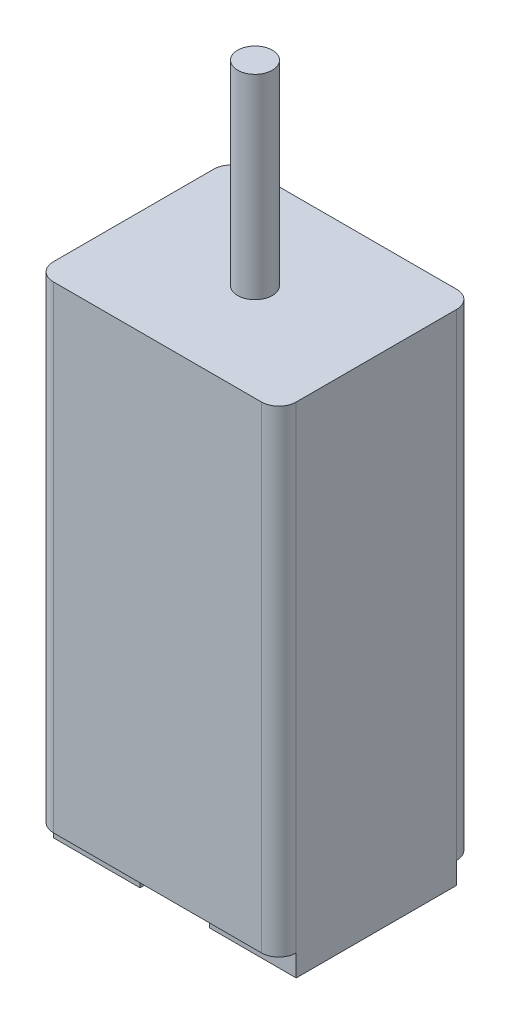
ISO-10303-21;
HEADER;
FILE_DESCRIPTION(('STEP AP214'),'2;1');
FILE_NAME('part.step','',(''),(''),'','','');
FILE_SCHEMA(('AUTOMOTIVE_DESIGN { 1 0 10303 214 1 1 1 1 }'));
ENDSEC;
DATA;
#1=APPLICATION_CONTEXT('core data for automotive mechanical design processes');
#2=APPLICATION_PROTOCOL_DEFINITION('international standard','automotive_design',2000,#1);
#3=PRODUCT_CONTEXT('',#1,'mechanical');
#4=PRODUCT('Part','Part','',(#3));
#5=PRODUCT_RELATED_PRODUCT_CATEGORY('part','',(#4));
#6=PRODUCT_DEFINITION_FORMATION('','',#4);
#7=PRODUCT_DEFINITION_CONTEXT('part definition',#1,'design');
#8=PRODUCT_DEFINITION('design','',#6,#7);
#9=PRODUCT_DEFINITION_SHAPE('','',#8);
#10=(LENGTH_UNIT() NAMED_UNIT(*) SI_UNIT(.MILLI.,.METRE.));
#11=(NAMED_UNIT(*) PLANE_ANGLE_UNIT() SI_UNIT($,.RADIAN.));
#12=(NAMED_UNIT(*) SI_UNIT($,.STERADIAN.) SOLID_ANGLE_UNIT());
#13=UNCERTAINTY_MEASURE_WITH_UNIT(LENGTH_MEASURE(1.E-05),#10,'distance_accuracy_value','');
#14=(GEOMETRIC_REPRESENTATION_CONTEXT(3) GLOBAL_UNCERTAINTY_ASSIGNED_CONTEXT((#13)) GLOBAL_UNIT_ASSIGNED_CONTEXT((#10,
#11,#12)) REPRESENTATION_CONTEXT('',''));
#15=CARTESIAN_POINT('',(0.,0.,0.));
#16=DIRECTION('',(0.,0.,1.));
#17=DIRECTION('',(1.,0.,0.));
#18=AXIS2_PLACEMENT_3D('',#15,#16,#17);
#19=CARTESIAN_POINT('',(0.,0.,0.));
#20=DIRECTION('',(0.,1.,0.));
#21=DIRECTION('',(0.,0.,1.));
#22=AXIS2_PLACEMENT_3D('',#19,#20,#21);
#23=PLANE('',#22);
#24=DIRECTION('',(-1.,0.,0.));
#25=VECTOR('',#24,1.);
#26=CARTESIAN_POINT('',(2.8,0.,1.85));
#27=LINE('',#26,#25);
#28=CARTESIAN_POINT('',(2.8,0.,1.85));
#29=VERTEX_POINT('',#28);
#30=CARTESIAN_POINT('',(0.8,0.,1.85));
#31=VERTEX_POINT('',#30);
#32=EDGE_CURVE('E321',#29,#31,#27,.T.);
#33=ORIENTED_EDGE('',*,*,#32,.F.);
#34=CARTESIAN_POINT('',(2.4,0.,1.85));
#35=DIRECTION('',(0.,1.,0.));
#36=DIRECTION('',(0.,0.,1.));
#37=AXIS2_PLACEMENT_3D('',#34,#35,#36);
#38=CIRCLE('',#37,0.4);
#39=CARTESIAN_POINT('',(2.4,0.,2.25));
#40=VERTEX_POINT('',#39);
#41=EDGE_CURVE('E271',#29,#40,#38,.F.);
#42=ORIENTED_EDGE('',*,*,#41,.T.);
#43=DIRECTION('',(1.,0.,0.));
#44=VECTOR('',#43,1.);
#45=CARTESIAN_POINT('',(-2.8,0.,2.25));
#46=LINE('',#45,#44);
#47=CARTESIAN_POINT('',(-2.4,0.,2.25));
#48=VERTEX_POINT('',#47);
#49=EDGE_CURVE('E246',#48,#40,#46,.T.);
#50=ORIENTED_EDGE('',*,*,#49,.F.);
#51=CARTESIAN_POINT('',(-2.4,0.,1.85));
#52=DIRECTION('',(0.,1.,0.));
#53=DIRECTION('',(0.,0.,1.));
#54=AXIS2_PLACEMENT_3D('',#51,#52,#53);
#55=CIRCLE('',#54,0.4);
#56=CARTESIAN_POINT('',(-2.8,0.,1.85));
#57=VERTEX_POINT('',#56);
#58=EDGE_CURVE('E274',#48,#57,#55,.F.);
#59=ORIENTED_EDGE('',*,*,#58,.T.);
#60=DIRECTION('',(-1.,0.,0.));
#61=VECTOR('',#60,1.);
#62=CARTESIAN_POINT('',(-2.8,0.,1.85));
#63=LINE('',#62,#61);
#64=CARTESIAN_POINT('',(-0.8,0.,1.85));
#65=VERTEX_POINT('',#64);
#66=EDGE_CURVE('E55',#65,#57,#63,.T.);
#67=ORIENTED_EDGE('',*,*,#66,.F.);
#68=DIRECTION('',(0.,0.,1.));
#69=VECTOR('',#68,1.);
#70=CARTESIAN_POINT('',(-0.8,0.,1.85));
#71=LINE('',#70,#69);
#72=CARTESIAN_POINT('',(-0.8,0.,-0.691387744426284));
#73=VERTEX_POINT('',#72);
#74=EDGE_CURVE('E59',#73,#65,#71,.T.);
#75=ORIENTED_EDGE('',*,*,#74,.F.);
#76=CARTESIAN_POINT('',(-0.93929380291808,0.,-1.27069387221314));
#77=DIRECTION('',(0.,-1.,0.));
#78=DIRECTION('',(0.,0.,-1.));
#79=AXIS2_PLACEMENT_3D('',#76,#77,#78);
#80=CIRCLE('',#79,0.595817382444306);
#81=CARTESIAN_POINT('',(-0.799999999999999,0.,-1.85));
#82=VERTEX_POINT('',#81);
#83=EDGE_CURVE('E184',#82,#73,#80,.T.);
#84=ORIENTED_EDGE('',*,*,#83,.F.);
#85=DIRECTION('',(1.,0.,0.));
#86=VECTOR('',#85,1.);
#87=CARTESIAN_POINT('',(-2.8,0.,-1.85));
#88=LINE('',#87,#86);
#89=CARTESIAN_POINT('',(-2.8,0.,-1.85));
#90=VERTEX_POINT('',#89);
#91=EDGE_CURVE('E179',#90,#82,#88,.T.);
#92=ORIENTED_EDGE('',*,*,#91,.F.);
#93=CARTESIAN_POINT('',(-2.4,0.,-1.85));
#94=DIRECTION('',(0.,1.,0.));
#95=DIRECTION('',(0.,0.,1.));
#96=AXIS2_PLACEMENT_3D('',#93,#94,#95);
#97=CIRCLE('',#96,0.4);
#98=CARTESIAN_POINT('',(-2.4,0.,-2.25));
#99=VERTEX_POINT('',#98);
#100=EDGE_CURVE('E277',#90,#99,#97,.F.);
#101=ORIENTED_EDGE('',*,*,#100,.T.);
#102=DIRECTION('',(-1.,0.,0.));
#103=VECTOR('',#102,1.);
#104=CARTESIAN_POINT('',(-2.8,0.,-2.25));
#105=LINE('',#104,#103);
#106=CARTESIAN_POINT('',(2.4,0.,-2.25));
#107=VERTEX_POINT('',#106);
#108=EDGE_CURVE('E237',#107,#99,#105,.T.);
#109=ORIENTED_EDGE('',*,*,#108,.F.);
#110=CARTESIAN_POINT('',(2.4,0.,-1.85));
#111=DIRECTION('',(0.,1.,0.));
#112=DIRECTION('',(0.,0.,1.));
#113=AXIS2_PLACEMENT_3D('',#110,#111,#112);
#114=CIRCLE('',#113,0.4);
#115=CARTESIAN_POINT('',(2.8,0.,-1.85));
#116=VERTEX_POINT('',#115);
#117=EDGE_CURVE('E280',#107,#116,#114,.F.);
#118=ORIENTED_EDGE('',*,*,#117,.T.);
#119=DIRECTION('',(1.,0.,0.));
#120=VECTOR('',#119,1.);
#121=CARTESIAN_POINT('',(2.8,0.,-1.85));
#122=LINE('',#121,#120);
#123=CARTESIAN_POINT('',(0.799999999999999,0.,-1.85));
#124=VERTEX_POINT('',#123);
#125=EDGE_CURVE('E171',#124,#116,#122,.T.);
#126=ORIENTED_EDGE('',*,*,#125,.F.);
#127=CARTESIAN_POINT('',(0.996674762888389,0.,-1.27069387221314));
#128=DIRECTION('',(0.,-1.,0.));
#129=DIRECTION('',(0.,0.,-1.));
#130=AXIS2_PLACEMENT_3D('',#127,#128,#129);
#131=CIRCLE('',#130,0.611781457751547);
#132=CARTESIAN_POINT('',(0.8,0.,-0.691387744426284));
#133=VERTEX_POINT('',#132);
#134=EDGE_CURVE('E327',#133,#124,#131,.T.);
#135=ORIENTED_EDGE('',*,*,#134,.F.);
#136=DIRECTION('',(0.,0.,-1.));
#137=VECTOR('',#136,1.);
#138=CARTESIAN_POINT('',(0.8,0.,1.85));
#139=LINE('',#138,#137);
#140=EDGE_CURVE('E323',#31,#133,#139,.T.);
#141=ORIENTED_EDGE('',*,*,#140,.F.);
#142=EDGE_LOOP('',(#33,#42,#50,#59,#67,#75,#84,#92,#101,#109,#118,#126,#135,#141));
#143=FACE_BOUND('',#142,.T.);
#144=ADVANCED_FACE('F39',(#143),#23,.F.);
#145=CARTESIAN_POINT('',(2.8,11.,-2.25));
#146=DIRECTION('',(-1.,0.,0.));
#147=DIRECTION('',(0.,0.,1.));
#148=AXIS2_PLACEMENT_3D('',#145,#146,#147);
#149=PLANE('',#148);
#150=DIRECTION('',(0.,-1.,0.));
#151=VECTOR('',#150,1.);
#152=CARTESIAN_POINT('',(2.8,11.,1.85));
#153=LINE('',#152,#151);
#154=CARTESIAN_POINT('',(2.8,11.,1.85));
#155=VERTEX_POINT('',#154);
#156=EDGE_CURVE('E177',#155,#29,#153,.T.);
#157=ORIENTED_EDGE('',*,*,#156,.T.);
#158=DIRECTION('',(0.,1.,0.));
#159=VECTOR('',#158,1.);
#160=CARTESIAN_POINT('',(2.8,-0.5,1.85));
#161=LINE('',#160,#159);
#162=CARTESIAN_POINT('',(2.8,-0.5,1.85));
#163=VERTEX_POINT('',#162);
#164=EDGE_CURVE('E154',#163,#29,#161,.T.);
#165=ORIENTED_EDGE('',*,*,#164,.F.);
#166=DIRECTION('',(0.,0.,1.));
#167=VECTOR('',#166,1.);
#168=CARTESIAN_POINT('',(2.8,-0.5,1.85));
#169=LINE('',#168,#167);
#170=CARTESIAN_POINT('',(2.8,-0.5,-1.85));
#171=VERTEX_POINT('',#170);
#172=EDGE_CURVE('E162',#171,#163,#169,.T.);
#173=ORIENTED_EDGE('',*,*,#172,.F.);
#174=DIRECTION('',(0.,1.,0.));
#175=VECTOR('',#174,1.);
#176=CARTESIAN_POINT('',(2.8,-0.5,-1.85));
#177=LINE('',#176,#175);
#178=EDGE_CURVE('E337',#171,#116,#177,.T.);
#179=ORIENTED_EDGE('',*,*,#178,.T.);
#180=DIRECTION('',(0.,-1.,0.));
#181=VECTOR('',#180,1.);
#182=CARTESIAN_POINT('',(2.8,11.,-1.85));
#183=LINE('',#182,#181);
#184=CARTESIAN_POINT('',(2.8,11.,-1.85));
#185=VERTEX_POINT('',#184);
#186=EDGE_CURVE('E286',#116,#185,#183,.F.);
#187=ORIENTED_EDGE('',*,*,#186,.T.);
#188=DIRECTION('',(0.,0.,-1.));
#189=VECTOR('',#188,1.);
#190=CARTESIAN_POINT('',(2.8,11.,-2.25));
#191=LINE('',#190,#189);
#192=EDGE_CURVE('E241',#155,#185,#191,.T.);
#193=ORIENTED_EDGE('',*,*,#192,.F.);
#194=EDGE_LOOP('',(#157,#165,#173,#179,#187,#193));
#195=FACE_BOUND('',#194,.T.);
#196=ADVANCED_FACE('F174',(#195),#149,.F.);
#197=CARTESIAN_POINT('',(-2.8,11.,-2.25));
#198=DIRECTION('',(0.,0.,1.));
#199=DIRECTION('',(1.,0.,0.));
#200=AXIS2_PLACEMENT_3D('',#197,#198,#199);
#201=PLANE('',#200);
#202=DIRECTION('',(-1.,0.,0.));
#203=VECTOR('',#202,1.);
#204=CARTESIAN_POINT('',(-2.8,11.,-2.25));
#205=LINE('',#204,#203);
#206=CARTESIAN_POINT('',(2.4,11.,-2.25));
#207=VERTEX_POINT('',#206);
#208=CARTESIAN_POINT('',(-2.4,11.,-2.25));
#209=VERTEX_POINT('',#208);
#210=EDGE_CURVE('E245',#207,#209,#205,.T.);
#211=ORIENTED_EDGE('',*,*,#210,.F.);
#212=DIRECTION('',(0.,-1.,0.));
#213=VECTOR('',#212,1.);
#214=CARTESIAN_POINT('',(2.4,11.,-2.25));
#215=LINE('',#214,#213);
#216=EDGE_CURVE('E267',#207,#107,#215,.T.);
#217=ORIENTED_EDGE('',*,*,#216,.T.);
#218=ORIENTED_EDGE('',*,*,#108,.T.);
#219=DIRECTION('',(0.,-1.,0.));
#220=VECTOR('',#219,1.);
#221=CARTESIAN_POINT('',(-2.4,11.,-2.25));
#222=LINE('',#221,#220);
#223=EDGE_CURVE('E258',#99,#209,#222,.F.);
#224=ORIENTED_EDGE('',*,*,#223,.T.);
#225=EDGE_LOOP('',(#211,#217,#218,#224));
#226=FACE_BOUND('',#225,.T.);
#227=ADVANCED_FACE('F376',(#226),#201,.F.);
#228=CARTESIAN_POINT('',(-2.8,11.,-2.25));
#229=DIRECTION('',(1.,0.,0.));
#230=DIRECTION('',(0.,0.,-1.));
#231=AXIS2_PLACEMENT_3D('',#228,#229,#230);
#232=PLANE('',#231);
#233=DIRECTION('',(0.,0.,1.));
#234=VECTOR('',#233,1.);
#235=CARTESIAN_POINT('',(-2.8,11.,-2.25));
#236=LINE('',#235,#234);
#237=CARTESIAN_POINT('',(-2.8,11.,-1.85));
#238=VERTEX_POINT('',#237);
#239=CARTESIAN_POINT('',(-2.8,11.,1.85));
#240=VERTEX_POINT('',#239);
#241=EDGE_CURVE('E250',#238,#240,#236,.T.);
#242=ORIENTED_EDGE('',*,*,#241,.F.);
#243=DIRECTION('',(0.,-1.,0.));
#244=VECTOR('',#243,1.);
#245=CARTESIAN_POINT('',(-2.8,11.,-1.85));
#246=LINE('',#245,#244);
#247=EDGE_CURVE('E304',#238,#90,#246,.T.);
#248=ORIENTED_EDGE('',*,*,#247,.T.);
#249=DIRECTION('',(0.,1.,0.));
#250=VECTOR('',#249,1.);
#251=CARTESIAN_POINT('',(-2.8,-0.5,-1.85));
#252=LINE('',#251,#250);
#253=CARTESIAN_POINT('',(-2.8,-0.5,-1.85));
#254=VERTEX_POINT('',#253);
#255=EDGE_CURVE('E228',#254,#90,#252,.T.);
#256=ORIENTED_EDGE('',*,*,#255,.F.);
#257=DIRECTION('',(0.,0.,-1.));
#258=VECTOR('',#257,1.);
#259=CARTESIAN_POINT('',(-2.8,-0.5,1.85));
#260=LINE('',#259,#258);
#261=CARTESIAN_POINT('',(-2.8,-0.5,1.85));
#262=VERTEX_POINT('',#261);
#263=EDGE_CURVE('E190',#262,#254,#260,.T.);
#264=ORIENTED_EDGE('',*,*,#263,.F.);
#265=DIRECTION('',(0.,1.,0.));
#266=VECTOR('',#265,1.);
#267=CARTESIAN_POINT('',(-2.8,-0.5,1.85));
#268=LINE('',#267,#266);
#269=EDGE_CURVE('E205',#262,#57,#268,.T.);
#270=ORIENTED_EDGE('',*,*,#269,.T.);
#271=DIRECTION('',(0.,-1.,0.));
#272=VECTOR('',#271,1.);
#273=CARTESIAN_POINT('',(-2.8,11.,1.85));
#274=LINE('',#273,#272);
#275=EDGE_CURVE('E301',#57,#240,#274,.F.);
#276=ORIENTED_EDGE('',*,*,#275,.T.);
#277=EDGE_LOOP('',(#242,#248,#256,#264,#270,#276));
#278=FACE_BOUND('',#277,.T.);
#279=ADVANCED_FACE('F383',(#278),#232,.F.);
#280=CARTESIAN_POINT('',(-2.8,11.,2.25));
#281=DIRECTION('',(0.,0.,-1.));
#282=DIRECTION('',(-1.,0.,0.));
#283=AXIS2_PLACEMENT_3D('',#280,#281,#282);
#284=PLANE('',#283);
#285=DIRECTION('',(1.,0.,0.));
#286=VECTOR('',#285,1.);
#287=CARTESIAN_POINT('',(-2.8,11.,2.25));
#288=LINE('',#287,#286);
#289=CARTESIAN_POINT('',(-2.4,11.,2.25));
#290=VERTEX_POINT('',#289);
#291=CARTESIAN_POINT('',(2.4,11.,2.25));
#292=VERTEX_POINT('',#291);
#293=EDGE_CURVE('E254',#290,#292,#288,.T.);
#294=ORIENTED_EDGE('',*,*,#293,.F.);
#295=DIRECTION('',(0.,-1.,0.));
#296=VECTOR('',#295,1.);
#297=CARTESIAN_POINT('',(-2.4,11.,2.25));
#298=LINE('',#297,#296);
#299=EDGE_CURVE('E11',#290,#48,#298,.T.);
#300=ORIENTED_EDGE('',*,*,#299,.T.);
#301=ORIENTED_EDGE('',*,*,#49,.T.);
#302=DIRECTION('',(0.,-1.,0.));
#303=VECTOR('',#302,1.);
#304=CARTESIAN_POINT('',(2.4,11.,2.25));
#305=LINE('',#304,#303);
#306=EDGE_CURVE('E48',#40,#292,#305,.F.);
#307=ORIENTED_EDGE('',*,*,#306,.T.);
#308=EDGE_LOOP('',(#294,#300,#301,#307));
#309=FACE_BOUND('',#308,.T.);
#310=ADVANCED_FACE('F311',(#309),#284,.F.);
#311=CARTESIAN_POINT('',(0.,11.,0.));
#312=DIRECTION('',(0.,1.,0.));
#313=DIRECTION('',(0.,0.,1.));
#314=AXIS2_PLACEMENT_3D('',#311,#312,#313);
#315=PLANE('',#314);
#316=CARTESIAN_POINT('',(0.,11.,0.));
#317=DIRECTION('',(0.,1.,0.));
#318=DIRECTION('',(0.,0.,1.));
#319=AXIS2_PLACEMENT_3D('',#316,#317,#318);
#320=CIRCLE('',#319,0.4);
#321=CARTESIAN_POINT('',(0.,11.,0.4));
#322=VERTEX_POINT('',#321);
#323=EDGE_CURVE('E232',#322,#322,#320,.T.);
#324=ORIENTED_EDGE('',*,*,#323,.F.);
#325=EDGE_LOOP('',(#324));
#326=FACE_BOUND('',#325,.T.);
#327=ORIENTED_EDGE('',*,*,#192,.T.);
#328=CARTESIAN_POINT('',(2.4,11.,-1.85));
#329=DIRECTION('',(0.,1.,0.));
#330=DIRECTION('',(0.,0.,1.));
#331=AXIS2_PLACEMENT_3D('',#328,#329,#330);
#332=CIRCLE('',#331,0.4);
#333=EDGE_CURVE('E298',#185,#207,#332,.T.);
#334=ORIENTED_EDGE('',*,*,#333,.T.);
#335=ORIENTED_EDGE('',*,*,#210,.T.);
#336=CARTESIAN_POINT('',(-2.4,11.,-1.85));
#337=DIRECTION('',(0.,1.,0.));
#338=DIRECTION('',(0.,0.,1.));
#339=AXIS2_PLACEMENT_3D('',#336,#337,#338);
#340=CIRCLE('',#339,0.4);
#341=EDGE_CURVE('E295',#209,#238,#340,.T.);
#342=ORIENTED_EDGE('',*,*,#341,.T.);
#343=ORIENTED_EDGE('',*,*,#241,.T.);
#344=CARTESIAN_POINT('',(-2.4,11.,1.85));
#345=DIRECTION('',(0.,1.,0.));
#346=DIRECTION('',(0.,0.,1.));
#347=AXIS2_PLACEMENT_3D('',#344,#345,#346);
#348=CIRCLE('',#347,0.4);
#349=EDGE_CURVE('E292',#240,#290,#348,.T.);
#350=ORIENTED_EDGE('',*,*,#349,.T.);
#351=ORIENTED_EDGE('',*,*,#293,.T.);
#352=CARTESIAN_POINT('',(2.4,11.,1.85));
#353=DIRECTION('',(0.,1.,0.));
#354=DIRECTION('',(0.,0.,1.));
#355=AXIS2_PLACEMENT_3D('',#352,#353,#354);
#356=CIRCLE('',#355,0.4);
#357=EDGE_CURVE('E289',#292,#155,#356,.T.);
#358=ORIENTED_EDGE('',*,*,#357,.T.);
#359=EDGE_LOOP('',(#327,#334,#335,#342,#343,#350,#351,#358));
#360=FACE_BOUND('',#359,.T.);
#361=ADVANCED_FACE('F318',(#326,#360),#315,.T.);
#362=CARTESIAN_POINT('',(0.,15.5,0.));
#363=DIRECTION('',(0.,-1.,0.));
#364=DIRECTION('',(0.,0.,-1.));
#365=AXIS2_PLACEMENT_3D('',#362,#363,#364);
#366=CYLINDRICAL_SURFACE('',#365,0.4);
#367=CARTESIAN_POINT('',(0.,15.5,0.));
#368=DIRECTION('',(0.,1.,0.));
#369=DIRECTION('',(0.,0.,1.));
#370=AXIS2_PLACEMENT_3D('',#367,#368,#369);
#371=CIRCLE('',#370,0.4);
#372=CARTESIAN_POINT('',(0.,15.5,0.4));
#373=VERTEX_POINT('',#372);
#374=EDGE_CURVE('E233',#373,#373,#371,.T.);
#375=ORIENTED_EDGE('',*,*,#374,.F.);
#376=EDGE_LOOP('',(#375));
#377=FACE_BOUND('',#376,.T.);
#378=ORIENTED_EDGE('',*,*,#323,.T.);
#379=EDGE_LOOP('',(#378));
#380=FACE_BOUND('',#379,.T.);
#381=ADVANCED_FACE('F434',(#377,#380),#366,.T.);
#382=CARTESIAN_POINT('',(0.,15.5,0.));
#383=DIRECTION('',(0.,1.,0.));
#384=DIRECTION('',(0.,0.,1.));
#385=AXIS2_PLACEMENT_3D('',#382,#383,#384);
#386=PLANE('',#385);
#387=ORIENTED_EDGE('',*,*,#374,.T.);
#388=EDGE_LOOP('',(#387));
#389=FACE_BOUND('',#388,.T.);
#390=ADVANCED_FACE('F394',(#389),#386,.T.);
#391=CARTESIAN_POINT('',(2.4,11.,-1.85));
#392=DIRECTION('',(0.,-1.,0.));
#393=DIRECTION('',(0.,0.,-1.));
#394=AXIS2_PLACEMENT_3D('',#391,#392,#393);
#395=CYLINDRICAL_SURFACE('',#394,0.4);
#396=ORIENTED_EDGE('',*,*,#333,.F.);
#397=ORIENTED_EDGE('',*,*,#186,.F.);
#398=ORIENTED_EDGE('',*,*,#117,.F.);
#399=ORIENTED_EDGE('',*,*,#216,.F.);
#400=EDGE_LOOP('',(#396,#397,#398,#399));
#401=FACE_BOUND('',#400,.T.);
#402=ADVANCED_FACE('F390',(#401),#395,.T.);
#403=CARTESIAN_POINT('',(-2.4,11.,-1.85));
#404=DIRECTION('',(0.,-1.,0.));
#405=DIRECTION('',(0.,0.,-1.));
#406=AXIS2_PLACEMENT_3D('',#403,#404,#405);
#407=CYLINDRICAL_SURFACE('',#406,0.4);
#408=ORIENTED_EDGE('',*,*,#341,.F.);
#409=ORIENTED_EDGE('',*,*,#223,.F.);
#410=ORIENTED_EDGE('',*,*,#100,.F.);
#411=ORIENTED_EDGE('',*,*,#247,.F.);
#412=EDGE_LOOP('',(#408,#409,#410,#411));
#413=FACE_BOUND('',#412,.T.);
#414=ADVANCED_FACE('F393',(#413),#407,.T.);
#415=CARTESIAN_POINT('',(-2.4,11.,1.85));
#416=DIRECTION('',(0.,-1.,0.));
#417=DIRECTION('',(0.,0.,-1.));
#418=AXIS2_PLACEMENT_3D('',#415,#416,#417);
#419=CYLINDRICAL_SURFACE('',#418,0.4);
#420=ORIENTED_EDGE('',*,*,#349,.F.);
#421=ORIENTED_EDGE('',*,*,#275,.F.);
#422=ORIENTED_EDGE('',*,*,#58,.F.);
#423=ORIENTED_EDGE('',*,*,#299,.F.);
#424=EDGE_LOOP('',(#420,#421,#422,#423));
#425=FACE_BOUND('',#424,.T.);
#426=ADVANCED_FACE('F397',(#425),#419,.T.);
#427=CARTESIAN_POINT('',(2.4,11.,1.85));
#428=DIRECTION('',(0.,-1.,0.));
#429=DIRECTION('',(0.,0.,-1.));
#430=AXIS2_PLACEMENT_3D('',#427,#428,#429);
#431=CYLINDRICAL_SURFACE('',#430,0.4);
#432=ORIENTED_EDGE('',*,*,#357,.F.);
#433=ORIENTED_EDGE('',*,*,#306,.F.);
#434=ORIENTED_EDGE('',*,*,#41,.F.);
#435=ORIENTED_EDGE('',*,*,#156,.F.);
#436=EDGE_LOOP('',(#432,#433,#434,#435));
#437=FACE_BOUND('',#436,.T.);
#438=ADVANCED_FACE('F41',(#437),#431,.T.);
#439=CARTESIAN_POINT('',(-2.8,-0.5,-1.85));
#440=DIRECTION('',(0.,0.,1.));
#441=DIRECTION('',(1.,0.,0.));
#442=AXIS2_PLACEMENT_3D('',#439,#440,#441);
#443=PLANE('',#442);
#444=ORIENTED_EDGE('',*,*,#91,.T.);
#445=DIRECTION('',(0.,1.,0.));
#446=VECTOR('',#445,1.);
#447=CARTESIAN_POINT('',(-0.799999999999999,-0.5,-1.85));
#448=LINE('',#447,#446);
#449=CARTESIAN_POINT('',(-0.799999999999999,-0.5,-1.85));
#450=VERTEX_POINT('',#449);
#451=EDGE_CURVE('E224',#450,#82,#448,.T.);
#452=ORIENTED_EDGE('',*,*,#451,.F.);
#453=DIRECTION('',(1.,0.,0.));
#454=VECTOR('',#453,1.);
#455=CARTESIAN_POINT('',(-2.8,-0.5,-1.85));
#456=LINE('',#455,#454);
#457=EDGE_CURVE('E194',#254,#450,#456,.T.);
#458=ORIENTED_EDGE('',*,*,#457,.F.);
#459=ORIENTED_EDGE('',*,*,#255,.T.);
#460=EDGE_LOOP('',(#444,#452,#458,#459));
#461=FACE_BOUND('',#460,.T.);
#462=ADVANCED_FACE('F404',(#461),#443,.F.);
#463=CARTESIAN_POINT('',(-0.93929380291808,-0.5,-1.27069387221314));
#464=DIRECTION('',(0.,1.,0.));
#465=DIRECTION('',(0.,0.,1.));
#466=AXIS2_PLACEMENT_3D('',#463,#464,#465);
#467=CYLINDRICAL_SURFACE('',#466,0.595817382444306);
#468=ORIENTED_EDGE('',*,*,#83,.T.);
#469=DIRECTION('',(0.,1.,0.));
#470=VECTOR('',#469,1.);
#471=CARTESIAN_POINT('',(-0.8,-0.5,-0.691387744426284));
#472=LINE('',#471,#470);
#473=CARTESIAN_POINT('',(-0.8,-0.5,-0.691387744426284));
#474=VERTEX_POINT('',#473);
#475=EDGE_CURVE('E220',#474,#73,#472,.T.);
#476=ORIENTED_EDGE('',*,*,#475,.F.);
#477=CARTESIAN_POINT('',(-0.93929380291808,-0.5,-1.27069387221314));
#478=DIRECTION('',(0.,-1.,0.));
#479=DIRECTION('',(0.,0.,-1.));
#480=AXIS2_PLACEMENT_3D('',#477,#478,#479);
#481=CIRCLE('',#480,0.595817382444306);
#482=EDGE_CURVE('E197',#450,#474,#481,.T.);
#483=ORIENTED_EDGE('',*,*,#482,.F.);
#484=ORIENTED_EDGE('',*,*,#451,.T.);
#485=EDGE_LOOP('',(#468,#476,#483,#484));
#486=FACE_BOUND('',#485,.T.);
#487=ADVANCED_FACE('F422',(#486),#467,.T.);
#488=CARTESIAN_POINT('',(-0.8,-0.5,1.85));
#489=DIRECTION('',(-1.,0.,0.));
#490=DIRECTION('',(0.,0.,1.));
#491=AXIS2_PLACEMENT_3D('',#488,#489,#490);
#492=PLANE('',#491);
#493=ORIENTED_EDGE('',*,*,#74,.T.);
#494=DIRECTION('',(0.,1.,0.));
#495=VECTOR('',#494,1.);
#496=CARTESIAN_POINT('',(-0.8,-0.5,1.85));
#497=LINE('',#496,#495);
#498=CARTESIAN_POINT('',(-0.8,-0.5,1.85));
#499=VERTEX_POINT('',#498);
#500=EDGE_CURVE('E216',#499,#65,#497,.T.);
#501=ORIENTED_EDGE('',*,*,#500,.F.);
#502=DIRECTION('',(0.,0.,1.));
#503=VECTOR('',#502,1.);
#504=CARTESIAN_POINT('',(-0.8,-0.5,1.85));
#505=LINE('',#504,#503);
#506=EDGE_CURVE('E200',#474,#499,#505,.T.);
#507=ORIENTED_EDGE('',*,*,#506,.F.);
#508=ORIENTED_EDGE('',*,*,#475,.T.);
#509=EDGE_LOOP('',(#493,#501,#507,#508));
#510=FACE_BOUND('',#509,.T.);
#511=ADVANCED_FACE('F420',(#510),#492,.F.);
#512=CARTESIAN_POINT('',(-2.8,-0.5,1.85));
#513=DIRECTION('',(0.,0.,-1.));
#514=DIRECTION('',(-1.,0.,0.));
#515=AXIS2_PLACEMENT_3D('',#512,#513,#514);
#516=PLANE('',#515);
#517=ORIENTED_EDGE('',*,*,#66,.T.);
#518=ORIENTED_EDGE('',*,*,#269,.F.);
#519=DIRECTION('',(-1.,0.,0.));
#520=VECTOR('',#519,1.);
#521=CARTESIAN_POINT('',(-2.8,-0.5,1.85));
#522=LINE('',#521,#520);
#523=EDGE_CURVE('E203',#499,#262,#522,.T.);
#524=ORIENTED_EDGE('',*,*,#523,.F.);
#525=ORIENTED_EDGE('',*,*,#500,.T.);
#526=EDGE_LOOP('',(#517,#518,#524,#525));
#527=FACE_BOUND('',#526,.T.);
#528=ADVANCED_FACE('F409',(#527),#516,.F.);
#529=CARTESIAN_POINT('',(-0.93929380291808,-0.5,-1.27069387221314));
#530=DIRECTION('',(0.,-1.,0.));
#531=DIRECTION('',(0.,0.,-1.));
#532=AXIS2_PLACEMENT_3D('',#529,#530,#531);
#533=PLANE('',#532);
#534=ORIENTED_EDGE('',*,*,#263,.T.);
#535=ORIENTED_EDGE('',*,*,#457,.T.);
#536=ORIENTED_EDGE('',*,*,#482,.T.);
#537=ORIENTED_EDGE('',*,*,#506,.T.);
#538=ORIENTED_EDGE('',*,*,#523,.T.);
#539=EDGE_LOOP('',(#534,#535,#536,#537,#538));
#540=FACE_BOUND('',#539,.T.);
#541=ADVANCED_FACE('F369',(#540),#533,.T.);
#542=CARTESIAN_POINT('',(2.8,-0.5,1.85));
#543=DIRECTION('',(0.,0.,-1.));
#544=DIRECTION('',(-1.,0.,0.));
#545=AXIS2_PLACEMENT_3D('',#542,#543,#544);
#546=PLANE('',#545);
#547=ORIENTED_EDGE('',*,*,#32,.T.);
#548=DIRECTION('',(0.,1.,0.));
#549=VECTOR('',#548,1.);
#550=CARTESIAN_POINT('',(0.8,-0.5,1.85));
#551=LINE('',#550,#549);
#552=CARTESIAN_POINT('',(0.8,-0.5,1.85));
#553=VERTEX_POINT('',#552);
#554=EDGE_CURVE('E157',#553,#31,#551,.T.);
#555=ORIENTED_EDGE('',*,*,#554,.F.);
#556=DIRECTION('',(-1.,0.,0.));
#557=VECTOR('',#556,1.);
#558=CARTESIAN_POINT('',(2.8,-0.5,1.85));
#559=LINE('',#558,#557);
#560=EDGE_CURVE('E150',#163,#553,#559,.T.);
#561=ORIENTED_EDGE('',*,*,#560,.F.);
#562=ORIENTED_EDGE('',*,*,#164,.T.);
#563=EDGE_LOOP('',(#547,#555,#561,#562));
#564=FACE_BOUND('',#563,.T.);
#565=ADVANCED_FACE('F152',(#564),#546,.F.);
#566=CARTESIAN_POINT('',(0.8,-0.5,1.85));
#567=DIRECTION('',(1.,0.,0.));
#568=DIRECTION('',(0.,0.,-1.));
#569=AXIS2_PLACEMENT_3D('',#566,#567,#568);
#570=PLANE('',#569);
#571=ORIENTED_EDGE('',*,*,#140,.T.);
#572=DIRECTION('',(0.,1.,0.));
#573=VECTOR('',#572,1.);
#574=CARTESIAN_POINT('',(0.8,-0.5,-0.691387744426284));
#575=LINE('',#574,#573);
#576=CARTESIAN_POINT('',(0.8,-0.5,-0.691387744426284));
#577=VERTEX_POINT('',#576);
#578=EDGE_CURVE('E186',#577,#133,#575,.T.);
#579=ORIENTED_EDGE('',*,*,#578,.F.);
#580=DIRECTION('',(0.,0.,-1.));
#581=VECTOR('',#580,1.);
#582=CARTESIAN_POINT('',(0.8,-0.5,1.85));
#583=LINE('',#582,#581);
#584=EDGE_CURVE('E161',#553,#577,#583,.T.);
#585=ORIENTED_EDGE('',*,*,#584,.F.);
#586=ORIENTED_EDGE('',*,*,#554,.T.);
#587=EDGE_LOOP('',(#571,#579,#585,#586));
#588=FACE_BOUND('',#587,.T.);
#589=ADVANCED_FACE('F361',(#588),#570,.F.);
#590=CARTESIAN_POINT('',(0.996674762888389,-0.5,-1.27069387221314));
#591=DIRECTION('',(0.,1.,0.));
#592=DIRECTION('',(0.,0.,1.));
#593=AXIS2_PLACEMENT_3D('',#590,#591,#592);
#594=CYLINDRICAL_SURFACE('',#593,0.611781457751547);
#595=ORIENTED_EDGE('',*,*,#134,.T.);
#596=DIRECTION('',(0.,1.,0.));
#597=VECTOR('',#596,1.);
#598=CARTESIAN_POINT('',(0.799999999999999,-0.5,-1.85));
#599=LINE('',#598,#597);
#600=CARTESIAN_POINT('',(0.799999999999999,-0.5,-1.85));
#601=VERTEX_POINT('',#600);
#602=EDGE_CURVE('E340',#601,#124,#599,.T.);
#603=ORIENTED_EDGE('',*,*,#602,.F.);
#604=CARTESIAN_POINT('',(0.996674762888389,-0.5,-1.27069387221314));
#605=DIRECTION('',(0.,-1.,0.));
#606=DIRECTION('',(0.,0.,-1.));
#607=AXIS2_PLACEMENT_3D('',#604,#605,#606);
#608=CIRCLE('',#607,0.611781457751547);
#609=EDGE_CURVE('E350',#577,#601,#608,.T.);
#610=ORIENTED_EDGE('',*,*,#609,.F.);
#611=ORIENTED_EDGE('',*,*,#578,.T.);
#612=EDGE_LOOP('',(#595,#603,#610,#611));
#613=FACE_BOUND('',#612,.T.);
#614=ADVANCED_FACE('F348',(#613),#594,.T.);
#615=CARTESIAN_POINT('',(2.8,-0.5,-1.85));
#616=DIRECTION('',(0.,0.,1.));
#617=DIRECTION('',(1.,0.,0.));
#618=AXIS2_PLACEMENT_3D('',#615,#616,#617);
#619=PLANE('',#618);
#620=ORIENTED_EDGE('',*,*,#125,.T.);
#621=ORIENTED_EDGE('',*,*,#178,.F.);
#622=DIRECTION('',(1.,0.,0.));
#623=VECTOR('',#622,1.);
#624=CARTESIAN_POINT('',(2.8,-0.5,-1.85));
#625=LINE('',#624,#623);
#626=EDGE_CURVE('E167',#601,#171,#625,.T.);
#627=ORIENTED_EDGE('',*,*,#626,.F.);
#628=ORIENTED_EDGE('',*,*,#602,.T.);
#629=EDGE_LOOP('',(#620,#621,#627,#628));
#630=FACE_BOUND('',#629,.T.);
#631=ADVANCED_FACE('F356',(#630),#619,.F.);
#632=CARTESIAN_POINT('',(0.996674762888389,-0.5,-1.27069387221314));
#633=DIRECTION('',(0.,-1.,0.));
#634=DIRECTION('',(0.,0.,-1.));
#635=AXIS2_PLACEMENT_3D('',#632,#633,#634);
#636=PLANE('',#635);
#637=ORIENTED_EDGE('',*,*,#172,.T.);
#638=ORIENTED_EDGE('',*,*,#560,.T.);
#639=ORIENTED_EDGE('',*,*,#584,.T.);
#640=ORIENTED_EDGE('',*,*,#609,.T.);
#641=ORIENTED_EDGE('',*,*,#626,.T.);
#642=EDGE_LOOP('',(#637,#638,#639,#640,#641));
#643=FACE_BOUND('',#642,.T.);
#644=ADVANCED_FACE('F165',(#643),#636,.T.);
#645=CLOSED_SHELL('',(#144,#196,#227,#279,#310,#361,#381,#390,#402,#414,#426,#438,#462,#487,
#511,#528,#541,#565,#589,#614,#631,#644));
#646=MANIFOLD_SOLID_BREP('B2',#645);
#647=ADVANCED_BREP_SHAPE_REPRESENTATION('',(#18,#646),#14);
#648=SHAPE_DEFINITION_REPRESENTATION(#9,#647);
ENDSEC;
END-ISO-10303-21;
